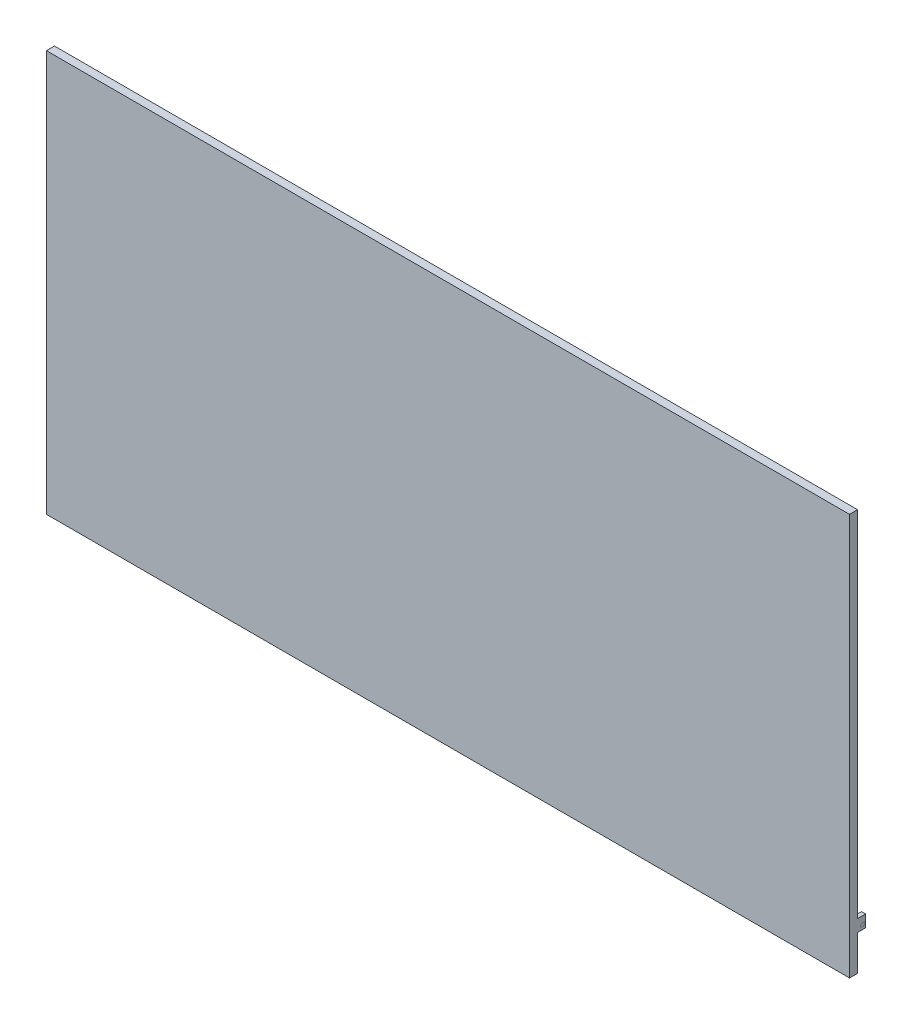
ISO-10303-21;
HEADER;
FILE_DESCRIPTION(('STEP AP214'),'2;1');
FILE_NAME('part.step','',(''),(''),'','','');
FILE_SCHEMA(('AUTOMOTIVE_DESIGN { 1 0 10303 214 1 1 1 1 }'));
ENDSEC;
DATA;
#1=APPLICATION_CONTEXT('core data for automotive mechanical design processes');
#2=APPLICATION_PROTOCOL_DEFINITION('international standard','automotive_design',2000,#1);
#3=PRODUCT_CONTEXT('',#1,'mechanical');
#4=PRODUCT('Part','Part','',(#3));
#5=PRODUCT_RELATED_PRODUCT_CATEGORY('part','',(#4));
#6=PRODUCT_DEFINITION_FORMATION('','',#4);
#7=PRODUCT_DEFINITION_CONTEXT('part definition',#1,'design');
#8=PRODUCT_DEFINITION('design','',#6,#7);
#9=PRODUCT_DEFINITION_SHAPE('','',#8);
#10=(LENGTH_UNIT() NAMED_UNIT(*) SI_UNIT(.MILLI.,.METRE.));
#11=(NAMED_UNIT(*) PLANE_ANGLE_UNIT() SI_UNIT($,.RADIAN.));
#12=(NAMED_UNIT(*) SI_UNIT($,.STERADIAN.) SOLID_ANGLE_UNIT());
#13=UNCERTAINTY_MEASURE_WITH_UNIT(LENGTH_MEASURE(1.E-05),#10,'distance_accuracy_value','');
#14=(GEOMETRIC_REPRESENTATION_CONTEXT(3) GLOBAL_UNCERTAINTY_ASSIGNED_CONTEXT((#13)) GLOBAL_UNIT_ASSIGNED_CONTEXT((#10,
#11,#12)) REPRESENTATION_CONTEXT('',''));
#15=CARTESIAN_POINT('',(0.,0.,0.));
#16=DIRECTION('',(0.,0.,1.));
#17=DIRECTION('',(1.,0.,0.));
#18=AXIS2_PLACEMENT_3D('',#15,#16,#17);
#19=CARTESIAN_POINT('',(443.244367229252,-116.841353694345,-10.));
#20=DIRECTION('',(1.,0.,0.));
#21=DIRECTION('',(0.,0.,-1.));
#22=AXIS2_PLACEMENT_3D('',#19,#20,#21);
#23=PLANE('',#22);
#24=DIRECTION('',(0.,1.,0.));
#25=VECTOR('',#24,1.);
#26=CARTESIAN_POINT('',(443.244367229252,-116.841353694345,0.));
#27=LINE('',#26,#25);
#28=CARTESIAN_POINT('',(443.244367229252,-241.841353694345,0.));
#29=VERTEX_POINT('',#28);
#30=CARTESIAN_POINT('',(443.244367229252,-116.841353694345,0.));
#31=VERTEX_POINT('',#30);
#32=EDGE_CURVE('E114',#29,#31,#27,.T.);
#33=ORIENTED_EDGE('',*,*,#32,.F.);
#34=DIRECTION('',(0.,0.,1.));
#35=VECTOR('',#34,1.);
#36=CARTESIAN_POINT('',(443.244367229252,-241.841353694345,-10.));
#37=LINE('',#36,#35);
#38=CARTESIAN_POINT('',(443.244367229252,-241.841353694345,-10.));
#39=VERTEX_POINT('',#38);
#40=EDGE_CURVE('E13',#39,#29,#37,.T.);
#41=ORIENTED_EDGE('',*,*,#40,.F.);
#42=DIRECTION('',(0.,1.,0.));
#43=VECTOR('',#42,1.);
#44=CARTESIAN_POINT('',(443.244367229252,-116.841353694345,-10.));
#45=LINE('',#44,#43);
#46=CARTESIAN_POINT('',(443.244367229252,-116.841353694345,-10.));
#47=VERTEX_POINT('',#46);
#48=EDGE_CURVE('E108',#39,#47,#45,.T.);
#49=ORIENTED_EDGE('',*,*,#48,.T.);
#50=DIRECTION('',(0.,0.,1.));
#51=VECTOR('',#50,1.);
#52=CARTESIAN_POINT('',(443.244367229252,-116.841353694345,-10.));
#53=LINE('',#52,#51);
#54=EDGE_CURVE('E53',#47,#31,#53,.T.);
#55=ORIENTED_EDGE('',*,*,#54,.T.);
#56=EDGE_LOOP('',(#33,#41,#49,#55));
#57=FACE_BOUND('',#56,.T.);
#58=ADVANCED_FACE('F50',(#57),#23,.T.);
#59=CARTESIAN_POINT('',(443.244367229252,-241.841353694345,-10.));
#60=DIRECTION('',(0.,-1.,0.));
#61=DIRECTION('',(1.,0.,0.));
#62=AXIS2_PLACEMENT_3D('',#59,#60,#61);
#63=PLANE('',#62);
#64=DIRECTION('',(1.,0.,0.));
#65=VECTOR('',#64,1.);
#66=CARTESIAN_POINT('',(443.244367229252,-241.841353694345,0.));
#67=LINE('',#66,#65);
#68=CARTESIAN_POINT('',(318.244367229252,-241.841353694345,0.));
#69=VERTEX_POINT('',#68);
#70=EDGE_CURVE('E110',#69,#29,#67,.T.);
#71=ORIENTED_EDGE('',*,*,#70,.F.);
#72=DIRECTION('',(0.,0.,1.));
#73=VECTOR('',#72,1.);
#74=CARTESIAN_POINT('',(318.244367229252,-241.841353694345,-10.));
#75=LINE('',#74,#73);
#76=CARTESIAN_POINT('',(318.244367229252,-241.841353694345,-10.));
#77=VERTEX_POINT('',#76);
#78=EDGE_CURVE('E59',#77,#69,#75,.T.);
#79=ORIENTED_EDGE('',*,*,#78,.F.);
#80=DIRECTION('',(1.,0.,0.));
#81=VECTOR('',#80,1.);
#82=CARTESIAN_POINT('',(443.244367229252,-241.841353694345,-10.));
#83=LINE('',#82,#81);
#84=EDGE_CURVE('E105',#77,#39,#83,.T.);
#85=ORIENTED_EDGE('',*,*,#84,.T.);
#86=ORIENTED_EDGE('',*,*,#40,.T.);
#87=EDGE_LOOP('',(#71,#79,#85,#86));
#88=FACE_BOUND('',#87,.T.);
#89=ADVANCED_FACE('F124',(#88),#63,.T.);
#90=CARTESIAN_POINT('',(318.244367229252,-116.841353694345,-10.));
#91=DIRECTION('',(-1.,0.,0.));
#92=DIRECTION('',(0.,0.,1.));
#93=AXIS2_PLACEMENT_3D('',#90,#91,#92);
#94=PLANE('',#93);
#95=DIRECTION('',(0.,-1.,0.));
#96=VECTOR('',#95,1.);
#97=CARTESIAN_POINT('',(318.244367229252,-116.841353694345,0.));
#98=LINE('',#97,#96);
#99=CARTESIAN_POINT('',(318.244367229252,-116.841353694345,0.));
#100=VERTEX_POINT('',#99);
#101=EDGE_CURVE('E100',#100,#69,#98,.T.);
#102=ORIENTED_EDGE('',*,*,#101,.F.);
#103=DIRECTION('',(0.,0.,1.));
#104=VECTOR('',#103,1.);
#105=CARTESIAN_POINT('',(318.244367229252,-116.841353694345,-10.));
#106=LINE('',#105,#104);
#107=CARTESIAN_POINT('',(318.244367229252,-116.841353694345,-10.));
#108=VERTEX_POINT('',#107);
#109=EDGE_CURVE('E95',#108,#100,#106,.T.);
#110=ORIENTED_EDGE('',*,*,#109,.F.);
#111=DIRECTION('',(0.,-1.,0.));
#112=VECTOR('',#111,1.);
#113=CARTESIAN_POINT('',(318.244367229252,-116.841353694345,-10.));
#114=LINE('',#113,#112);
#115=EDGE_CURVE('E98',#108,#77,#114,.T.);
#116=ORIENTED_EDGE('',*,*,#115,.T.);
#117=ORIENTED_EDGE('',*,*,#78,.T.);
#118=EDGE_LOOP('',(#102,#110,#116,#117));
#119=FACE_BOUND('',#118,.T.);
#120=ADVANCED_FACE('F97',(#119),#94,.T.);
#121=CARTESIAN_POINT('',(443.244367229252,-116.841353694345,-10.));
#122=DIRECTION('',(0.,1.,0.));
#123=DIRECTION('',(-1.,0.,0.));
#124=AXIS2_PLACEMENT_3D('',#121,#122,#123);
#125=PLANE('',#124);
#126=DIRECTION('',(-1.,0.,0.));
#127=VECTOR('',#126,1.);
#128=CARTESIAN_POINT('',(443.244367229252,-116.841353694345,0.));
#129=LINE('',#128,#127);
#130=EDGE_CURVE('E117',#31,#100,#129,.T.);
#131=ORIENTED_EDGE('',*,*,#130,.F.);
#132=ORIENTED_EDGE('',*,*,#54,.F.);
#133=DIRECTION('',(-1.,0.,0.));
#134=VECTOR('',#133,1.);
#135=CARTESIAN_POINT('',(443.244367229252,-116.841353694345,-10.));
#136=LINE('',#135,#134);
#137=EDGE_CURVE('E104',#47,#108,#136,.T.);
#138=ORIENTED_EDGE('',*,*,#137,.T.);
#139=ORIENTED_EDGE('',*,*,#109,.T.);
#140=EDGE_LOOP('',(#131,#132,#138,#139));
#141=FACE_BOUND('',#140,.T.);
#142=ADVANCED_FACE('F107',(#141),#125,.T.);
#143=CARTESIAN_POINT('',(0.,0.,-10.));
#144=DIRECTION('',(0.,0.,-1.));
#145=DIRECTION('',(-1.,0.,0.));
#146=AXIS2_PLACEMENT_3D('',#143,#144,#145);
#147=PLANE('',#146);
#148=ORIENTED_EDGE('',*,*,#48,.F.);
#149=ORIENTED_EDGE('',*,*,#84,.F.);
#150=ORIENTED_EDGE('',*,*,#115,.F.);
#151=ORIENTED_EDGE('',*,*,#137,.F.);
#152=EDGE_LOOP('',(#148,#149,#150,#151));
#153=FACE_BOUND('',#152,.T.);
#154=ADVANCED_FACE('F103',(#153),#147,.T.);
#155=CARTESIAN_POINT('',(0.,0.,0.));
#156=DIRECTION('',(0.,0.,-1.));
#157=DIRECTION('',(-1.,0.,0.));
#158=AXIS2_PLACEMENT_3D('',#155,#156,#157);
#159=PLANE('',#158);
#160=ORIENTED_EDGE('',*,*,#32,.T.);
#161=ORIENTED_EDGE('',*,*,#130,.T.);
#162=ORIENTED_EDGE('',*,*,#101,.T.);
#163=ORIENTED_EDGE('',*,*,#70,.T.);
#164=EDGE_LOOP('',(#160,#161,#162,#163));
#165=FACE_BOUND('',#164,.T.);
#166=ADVANCED_FACE('F123',(#165),#159,.F.);
#167=CLOSED_SHELL('',(#58,#89,#120,#142,#154,#166));
#168=MANIFOLD_SOLID_BREP('B2',#167);
#169=CARTESIAN_POINT('',(0.,0.,-0.01));
#170=DIRECTION('',(0.,0.,1.));
#171=DIRECTION('',(1.,0.,0.));
#172=AXIS2_PLACEMENT_3D('',#169,#170,#171);
#173=PLANE('',#172);
#174=DIRECTION('',(1.,0.,0.));
#175=VECTOR('',#174,1.);
#176=CARTESIAN_POINT('',(474.06976744186,-185.094305416104,-0.01));
#177=LINE('',#176,#175);
#178=CARTESIAN_POINT('',(474.06976744186,-185.094305416104,-0.01));
#179=VERTEX_POINT('',#178);
#180=CARTESIAN_POINT('',(479.06976744186,-185.094305416104,-0.01));
#181=VERTEX_POINT('',#180);
#182=EDGE_CURVE('E196',#179,#181,#177,.T.);
#183=ORIENTED_EDGE('',*,*,#182,.F.);
#184=DIRECTION('',(0.,1.,0.));
#185=VECTOR('',#184,1.);
#186=CARTESIAN_POINT('',(474.06976744186,-185.094305416104,-0.01));
#187=LINE('',#186,#185);
#188=CARTESIAN_POINT('',(474.06976744186,-200.094305416104,-0.01));
#189=VERTEX_POINT('',#188);
#190=EDGE_CURVE('E301',#189,#179,#187,.T.);
#191=ORIENTED_EDGE('',*,*,#190,.F.);
#192=DIRECTION('',(-1.,0.,0.));
#193=VECTOR('',#192,1.);
#194=CARTESIAN_POINT('',(474.06976744186,-200.094305416104,-0.01));
#195=LINE('',#194,#193);
#196=CARTESIAN_POINT('',(479.06976744186,-200.094305416104,-0.01));
#197=VERTEX_POINT('',#196);
#198=EDGE_CURVE('E298',#197,#189,#195,.T.);
#199=ORIENTED_EDGE('',*,*,#198,.F.);
#200=DIRECTION('',(0.,1.,0.));
#201=VECTOR('',#200,1.);
#202=CARTESIAN_POINT('',(479.06976744186,255.813953488372,-0.01));
#203=LINE('',#202,#201);
#204=CARTESIAN_POINT('',(479.06976744186,-244.186046511628,-0.01));
#205=VERTEX_POINT('',#204);
#206=EDGE_CURVE('E360',#205,#197,#203,.T.);
#207=ORIENTED_EDGE('',*,*,#206,.F.);
#208=DIRECTION('',(1.,0.,0.));
#209=VECTOR('',#208,1.);
#210=CARTESIAN_POINT('',(-520.93023255814,-244.186046511628,-0.01));
#211=LINE('',#210,#209);
#212=CARTESIAN_POINT('',(-520.93023255814,-244.186046511628,-0.01));
#213=VERTEX_POINT('',#212);
#214=EDGE_CURVE('E357',#213,#205,#211,.T.);
#215=ORIENTED_EDGE('',*,*,#214,.F.);
#216=DIRECTION('',(0.,-1.,0.));
#217=VECTOR('',#216,1.);
#218=CARTESIAN_POINT('',(-520.93023255814,255.813953488372,-0.01));
#219=LINE('',#218,#217);
#220=CARTESIAN_POINT('',(-520.93023255814,-207.514368944534,-0.01));
#221=VERTEX_POINT('',#220);
#222=EDGE_CURVE('E353',#221,#213,#219,.T.);
#223=ORIENTED_EDGE('',*,*,#222,.F.);
#224=DIRECTION('',(1.,0.,0.));
#225=VECTOR('',#224,1.);
#226=CARTESIAN_POINT('',(0.,-207.514368944534,-0.01));
#227=LINE('',#226,#225);
#228=CARTESIAN_POINT('',(-515.934557334186,-207.514368944534,-0.01));
#229=VERTEX_POINT('',#228);
#230=EDGE_CURVE('E369',#221,#229,#227,.T.);
#231=ORIENTED_EDGE('',*,*,#230,.T.);
#232=DIRECTION('',(0.,1.,0.));
#233=VECTOR('',#232,1.);
#234=CARTESIAN_POINT('',(-515.934557334186,0.,-0.01));
#235=LINE('',#234,#233);
#236=CARTESIAN_POINT('',(-515.934557334186,-192.514368944533,-0.00999999999999959));
#237=VERTEX_POINT('',#236);
#238=EDGE_CURVE('E377',#229,#237,#235,.T.);
#239=ORIENTED_EDGE('',*,*,#238,.T.);
#240=DIRECTION('',(-1.,0.,0.));
#241=VECTOR('',#240,1.);
#242=CARTESIAN_POINT('',(0.,-192.514368944533,-0.01));
#243=LINE('',#242,#241);
#244=CARTESIAN_POINT('',(-520.93023255814,-192.514368944533,-0.01));
#245=VERTEX_POINT('',#244);
#246=EDGE_CURVE('E189',#237,#245,#243,.T.);
#247=ORIENTED_EDGE('',*,*,#246,.T.);
#248=CARTESIAN_POINT('',(-520.93023255814,255.813953488372,-0.01));
#249=VERTEX_POINT('',#248);
#250=EDGE_CURVE('E354',#249,#245,#219,.T.);
#251=ORIENTED_EDGE('',*,*,#250,.F.);
#252=DIRECTION('',(-1.,0.,0.));
#253=VECTOR('',#252,1.);
#254=CARTESIAN_POINT('',(-520.93023255814,255.813953488372,-0.01));
#255=LINE('',#254,#253);
#256=CARTESIAN_POINT('',(479.06976744186,255.813953488372,-0.01));
#257=VERTEX_POINT('',#256);
#258=EDGE_CURVE('E363',#257,#249,#255,.T.);
#259=ORIENTED_EDGE('',*,*,#258,.F.);
#260=EDGE_CURVE('E201',#181,#257,#203,.T.);
#261=ORIENTED_EDGE('',*,*,#260,.F.);
#262=EDGE_LOOP('',(#183,#191,#199,#207,#215,#223,#231,#239,#247,#251,#259,#261));
#263=FACE_BOUND('',#262,.T.);
#264=ADVANCED_FACE('F181',(#263),#173,.F.);
#265=CARTESIAN_POINT('',(-520.93023255814,255.813953488372,-0.01));
#266=DIRECTION('',(-1.,0.,0.));
#267=DIRECTION('',(0.,0.,1.));
#268=AXIS2_PLACEMENT_3D('',#265,#266,#267);
#269=PLANE('',#268);
#270=DIRECTION('',(0.,0.,-1.));
#271=VECTOR('',#270,1.);
#272=CARTESIAN_POINT('',(-520.93023255814,-192.514368944533,-0.01));
#273=LINE('',#272,#271);
#274=CARTESIAN_POINT('',(-520.93023255814,-192.514368944533,0.));
#275=VERTEX_POINT('',#274);
#276=EDGE_CURVE('E339',#275,#245,#273,.T.);
#277=ORIENTED_EDGE('',*,*,#276,.F.);
#278=DIRECTION('',(0.,1.,0.));
#279=VECTOR('',#278,1.);
#280=CARTESIAN_POINT('',(-520.93023255814,255.813953488372,0.));
#281=LINE('',#280,#279);
#282=CARTESIAN_POINT('',(-520.93023255814,-207.514368944534,0.));
#283=VERTEX_POINT('',#282);
#284=EDGE_CURVE('E48',#283,#275,#281,.T.);
#285=ORIENTED_EDGE('',*,*,#284,.F.);
#286=DIRECTION('',(0.,0.,1.));
#287=VECTOR('',#286,1.);
#288=CARTESIAN_POINT('',(-520.93023255814,-207.514368944534,-0.01));
#289=LINE('',#288,#287);
#290=EDGE_CURVE('E331',#221,#283,#289,.T.);
#291=ORIENTED_EDGE('',*,*,#290,.F.);
#292=ORIENTED_EDGE('',*,*,#222,.T.);
#293=DIRECTION('',(0.,0.,1.));
#294=VECTOR('',#293,1.);
#295=CARTESIAN_POINT('',(-520.93023255814,-244.186046511628,-0.01));
#296=LINE('',#295,#294);
#297=CARTESIAN_POINT('',(-520.93023255814,-244.186046511628,10.));
#298=VERTEX_POINT('',#297);
#299=EDGE_CURVE('E366',#213,#298,#296,.T.);
#300=ORIENTED_EDGE('',*,*,#299,.T.);
#301=DIRECTION('',(0.,-1.,0.));
#302=VECTOR('',#301,1.);
#303=CARTESIAN_POINT('',(-520.93023255814,255.813953488372,10.));
#304=LINE('',#303,#302);
#305=CARTESIAN_POINT('',(-520.93023255814,255.813953488372,10.));
#306=VERTEX_POINT('',#305);
#307=EDGE_CURVE('E341',#306,#298,#304,.T.);
#308=ORIENTED_EDGE('',*,*,#307,.F.);
#309=DIRECTION('',(0.,0.,1.));
#310=VECTOR('',#309,1.);
#311=CARTESIAN_POINT('',(-520.93023255814,255.813953488372,-0.01));
#312=LINE('',#311,#310);
#313=EDGE_CURVE('E367',#249,#306,#312,.T.);
#314=ORIENTED_EDGE('',*,*,#313,.F.);
#315=ORIENTED_EDGE('',*,*,#250,.T.);
#316=EDGE_LOOP('',(#277,#285,#291,#292,#300,#308,#314,#315));
#317=FACE_BOUND('',#316,.T.);
#318=ADVANCED_FACE('F183',(#317),#269,.T.);
#319=CARTESIAN_POINT('',(-520.93023255814,255.813953488372,-0.01));
#320=DIRECTION('',(0.,1.,0.));
#321=DIRECTION('',(0.,0.,1.));
#322=AXIS2_PLACEMENT_3D('',#319,#320,#321);
#323=PLANE('',#322);
#324=ORIENTED_EDGE('',*,*,#313,.T.);
#325=DIRECTION('',(-1.,0.,0.));
#326=VECTOR('',#325,1.);
#327=CARTESIAN_POINT('',(-520.93023255814,255.813953488372,10.));
#328=LINE('',#327,#326);
#329=CARTESIAN_POINT('',(479.06976744186,255.813953488372,10.));
#330=VERTEX_POINT('',#329);
#331=EDGE_CURVE('E350',#330,#306,#328,.T.);
#332=ORIENTED_EDGE('',*,*,#331,.F.);
#333=DIRECTION('',(0.,0.,1.));
#334=VECTOR('',#333,1.);
#335=CARTESIAN_POINT('',(479.06976744186,255.813953488372,-0.01));
#336=LINE('',#335,#334);
#337=EDGE_CURVE('E370',#257,#330,#336,.T.);
#338=ORIENTED_EDGE('',*,*,#337,.F.);
#339=ORIENTED_EDGE('',*,*,#258,.T.);
#340=EDGE_LOOP('',(#324,#332,#338,#339));
#341=FACE_BOUND('',#340,.T.);
#342=ADVANCED_FACE('F389',(#341),#323,.T.);
#343=CARTESIAN_POINT('',(479.06976744186,255.813953488372,-0.01));
#344=DIRECTION('',(1.,0.,0.));
#345=DIRECTION('',(0.,0.,-1.));
#346=AXIS2_PLACEMENT_3D('',#343,#344,#345);
#347=PLANE('',#346);
#348=ORIENTED_EDGE('',*,*,#337,.T.);
#349=DIRECTION('',(0.,1.,0.));
#350=VECTOR('',#349,1.);
#351=CARTESIAN_POINT('',(479.06976744186,255.813953488372,10.));
#352=LINE('',#351,#350);
#353=CARTESIAN_POINT('',(479.06976744186,-244.186046511628,10.));
#354=VERTEX_POINT('',#353);
#355=EDGE_CURVE('E347',#354,#330,#352,.T.);
#356=ORIENTED_EDGE('',*,*,#355,.F.);
#357=DIRECTION('',(0.,0.,1.));
#358=VECTOR('',#357,1.);
#359=CARTESIAN_POINT('',(479.06976744186,-244.186046511628,-0.01));
#360=LINE('',#359,#358);
#361=EDGE_CURVE('E372',#205,#354,#360,.T.);
#362=ORIENTED_EDGE('',*,*,#361,.F.);
#363=ORIENTED_EDGE('',*,*,#206,.T.);
#364=DIRECTION('',(0.,0.,1.));
#365=VECTOR('',#364,1.);
#366=CARTESIAN_POINT('',(479.06976744186,-200.094305416104,-10.01));
#367=LINE('',#366,#365);
#368=CARTESIAN_POINT('',(479.06976744186,-200.094305416104,-10.01));
#369=VERTEX_POINT('',#368);
#370=EDGE_CURVE('E307',#369,#197,#367,.T.);
#371=ORIENTED_EDGE('',*,*,#370,.F.);
#372=DIRECTION('',(0.,-1.,0.));
#373=VECTOR('',#372,1.);
#374=CARTESIAN_POINT('',(479.06976744186,-185.094305416104,-10.01));
#375=LINE('',#374,#373);
#376=CARTESIAN_POINT('',(479.06976744186,-185.094305416104,-10.01));
#377=VERTEX_POINT('',#376);
#378=EDGE_CURVE('E288',#377,#369,#375,.T.);
#379=ORIENTED_EDGE('',*,*,#378,.F.);
#380=DIRECTION('',(0.,0.,1.));
#381=VECTOR('',#380,1.);
#382=CARTESIAN_POINT('',(479.06976744186,-185.094305416104,-10.01));
#383=LINE('',#382,#381);
#384=EDGE_CURVE('E285',#377,#181,#383,.T.);
#385=ORIENTED_EDGE('',*,*,#384,.T.);
#386=ORIENTED_EDGE('',*,*,#260,.T.);
#387=EDGE_LOOP('',(#348,#356,#362,#363,#371,#379,#385,#386));
#388=FACE_BOUND('',#387,.T.);
#389=ADVANCED_FACE('F396',(#388),#347,.T.);
#390=CARTESIAN_POINT('',(-520.93023255814,-244.186046511628,-0.01));
#391=DIRECTION('',(0.,-1.,0.));
#392=DIRECTION('',(0.,0.,-1.));
#393=AXIS2_PLACEMENT_3D('',#390,#391,#392);
#394=PLANE('',#393);
#395=ORIENTED_EDGE('',*,*,#361,.T.);
#396=DIRECTION('',(1.,0.,0.));
#397=VECTOR('',#396,1.);
#398=CARTESIAN_POINT('',(-520.93023255814,-244.186046511628,10.));
#399=LINE('',#398,#397);
#400=EDGE_CURVE('E344',#298,#354,#399,.T.);
#401=ORIENTED_EDGE('',*,*,#400,.F.);
#402=ORIENTED_EDGE('',*,*,#299,.F.);
#403=ORIENTED_EDGE('',*,*,#214,.T.);
#404=EDGE_LOOP('',(#395,#401,#402,#403));
#405=FACE_BOUND('',#404,.T.);
#406=ADVANCED_FACE('F414',(#405),#394,.T.);
#407=CARTESIAN_POINT('',(0.,0.,10.));
#408=DIRECTION('',(0.,0.,1.));
#409=DIRECTION('',(1.,0.,0.));
#410=AXIS2_PLACEMENT_3D('',#407,#408,#409);
#411=PLANE('',#410);
#412=ORIENTED_EDGE('',*,*,#307,.T.);
#413=ORIENTED_EDGE('',*,*,#400,.T.);
#414=ORIENTED_EDGE('',*,*,#355,.T.);
#415=ORIENTED_EDGE('',*,*,#331,.T.);
#416=EDGE_LOOP('',(#412,#413,#414,#415));
#417=FACE_BOUND('',#416,.T.);
#418=ADVANCED_FACE('F392',(#417),#411,.T.);
#419=CARTESIAN_POINT('',(-515.934557334186,-192.514368944533,-10.));
#420=DIRECTION('',(1.,0.,0.));
#421=DIRECTION('',(0.,0.,-1.));
#422=AXIS2_PLACEMENT_3D('',#419,#420,#421);
#423=PLANE('',#422);
#424=ORIENTED_EDGE('',*,*,#238,.F.);
#425=DIRECTION('',(0.,0.,1.));
#426=VECTOR('',#425,1.);
#427=CARTESIAN_POINT('',(-515.934557334186,-207.514368944534,-10.));
#428=LINE('',#427,#426);
#429=CARTESIAN_POINT('',(-515.934557334186,-207.514368944534,-10.));
#430=VERTEX_POINT('',#429);
#431=EDGE_CURVE('E335',#430,#229,#428,.T.);
#432=ORIENTED_EDGE('',*,*,#431,.F.);
#433=DIRECTION('',(0.,1.,0.));
#434=VECTOR('',#433,1.);
#435=CARTESIAN_POINT('',(-515.934557334186,-192.514368944533,-10.));
#436=LINE('',#435,#434);
#437=CARTESIAN_POINT('',(-515.934557334186,-192.514368944533,-10.));
#438=VERTEX_POINT('',#437);
#439=EDGE_CURVE('E318',#430,#438,#436,.T.);
#440=ORIENTED_EDGE('',*,*,#439,.T.);
#441=DIRECTION('',(0.,0.,1.));
#442=VECTOR('',#441,1.);
#443=CARTESIAN_POINT('',(-515.934557334186,-192.514368944533,-10.));
#444=LINE('',#443,#442);
#445=EDGE_CURVE('E332',#438,#237,#444,.T.);
#446=ORIENTED_EDGE('',*,*,#445,.T.);
#447=EDGE_LOOP('',(#424,#432,#440,#446));
#448=FACE_BOUND('',#447,.T.);
#449=ADVANCED_FACE('F422',(#448),#423,.T.);
#450=CARTESIAN_POINT('',(-520.934557334186,-192.514368944533,-10.));
#451=DIRECTION('',(-1.,0.,0.));
#452=DIRECTION('',(0.,0.,1.));
#453=AXIS2_PLACEMENT_3D('',#450,#451,#452);
#454=PLANE('',#453);
#455=DIRECTION('',(0.,-1.,0.));
#456=VECTOR('',#455,1.);
#457=CARTESIAN_POINT('',(-520.934557334186,-192.514368944533,0.));
#458=LINE('',#457,#456);
#459=CARTESIAN_POINT('',(-520.934557334186,-192.514368944533,0.));
#460=VERTEX_POINT('',#459);
#461=CARTESIAN_POINT('',(-520.934557334186,-207.514368944534,0.));
#462=VERTEX_POINT('',#461);
#463=EDGE_CURVE('E302',#460,#462,#458,.T.);
#464=ORIENTED_EDGE('',*,*,#463,.F.);
#465=DIRECTION('',(0.,0.,1.));
#466=VECTOR('',#465,1.);
#467=CARTESIAN_POINT('',(-520.934557334186,-192.514368944533,-10.));
#468=LINE('',#467,#466);
#469=CARTESIAN_POINT('',(-520.934557334186,-192.514368944533,-10.));
#470=VERTEX_POINT('',#469);
#471=EDGE_CURVE('E328',#470,#460,#468,.T.);
#472=ORIENTED_EDGE('',*,*,#471,.F.);
#473=DIRECTION('',(0.,-1.,0.));
#474=VECTOR('',#473,1.);
#475=CARTESIAN_POINT('',(-520.934557334186,-192.514368944533,-10.));
#476=LINE('',#475,#474);
#477=CARTESIAN_POINT('',(-520.934557334186,-207.514368944534,-10.));
#478=VERTEX_POINT('',#477);
#479=EDGE_CURVE('E311',#470,#478,#476,.T.);
#480=ORIENTED_EDGE('',*,*,#479,.T.);
#481=DIRECTION('',(0.,0.,1.));
#482=VECTOR('',#481,1.);
#483=CARTESIAN_POINT('',(-520.934557334186,-207.514368944534,-10.));
#484=LINE('',#483,#482);
#485=EDGE_CURVE('E323',#478,#462,#484,.T.);
#486=ORIENTED_EDGE('',*,*,#485,.T.);
#487=EDGE_LOOP('',(#464,#472,#480,#486));
#488=FACE_BOUND('',#487,.T.);
#489=ADVANCED_FACE('F431',(#488),#454,.T.);
#490=CARTESIAN_POINT('',(-520.934557334186,-192.514368944533,-10.));
#491=DIRECTION('',(0.,1.,0.));
#492=DIRECTION('',(0.,0.,1.));
#493=AXIS2_PLACEMENT_3D('',#490,#491,#492);
#494=PLANE('',#493);
#495=DIRECTION('',(-1.,0.,0.));
#496=VECTOR('',#495,1.);
#497=CARTESIAN_POINT('',(-520.934557334186,-192.514368944533,0.));
#498=LINE('',#497,#496);
#499=EDGE_CURVE('E315',#275,#460,#498,.T.);
#500=ORIENTED_EDGE('',*,*,#499,.F.);
#501=ORIENTED_EDGE('',*,*,#276,.T.);
#502=ORIENTED_EDGE('',*,*,#246,.F.);
#503=ORIENTED_EDGE('',*,*,#445,.F.);
#504=DIRECTION('',(-1.,0.,0.));
#505=VECTOR('',#504,1.);
#506=CARTESIAN_POINT('',(-520.934557334186,-192.514368944533,-10.));
#507=LINE('',#506,#505);
#508=EDGE_CURVE('E321',#438,#470,#507,.T.);
#509=ORIENTED_EDGE('',*,*,#508,.T.);
#510=ORIENTED_EDGE('',*,*,#471,.T.);
#511=EDGE_LOOP('',(#500,#501,#502,#503,#509,#510));
#512=FACE_BOUND('',#511,.T.);
#513=ADVANCED_FACE('F425',(#512),#494,.T.);
#514=CARTESIAN_POINT('',(-520.934557334186,-207.514368944534,-10.));
#515=DIRECTION('',(0.,-1.,0.));
#516=DIRECTION('',(0.,0.,-1.));
#517=AXIS2_PLACEMENT_3D('',#514,#515,#516);
#518=PLANE('',#517);
#519=ORIENTED_EDGE('',*,*,#230,.F.);
#520=ORIENTED_EDGE('',*,*,#290,.T.);
#521=DIRECTION('',(1.,0.,0.));
#522=VECTOR('',#521,1.);
#523=CARTESIAN_POINT('',(-520.934557334186,-207.514368944534,0.));
#524=LINE('',#523,#522);
#525=EDGE_CURVE('E305',#462,#283,#524,.T.);
#526=ORIENTED_EDGE('',*,*,#525,.F.);
#527=ORIENTED_EDGE('',*,*,#485,.F.);
#528=DIRECTION('',(1.,0.,0.));
#529=VECTOR('',#528,1.);
#530=CARTESIAN_POINT('',(-520.934557334186,-207.514368944534,-10.));
#531=LINE('',#530,#529);
#532=EDGE_CURVE('E314',#478,#430,#531,.T.);
#533=ORIENTED_EDGE('',*,*,#532,.T.);
#534=ORIENTED_EDGE('',*,*,#431,.T.);
#535=EDGE_LOOP('',(#519,#520,#526,#527,#533,#534));
#536=FACE_BOUND('',#535,.T.);
#537=ADVANCED_FACE('F417',(#536),#518,.T.);
#538=CARTESIAN_POINT('',(0.,0.,-10.));
#539=DIRECTION('',(0.,0.,1.));
#540=DIRECTION('',(1.,0.,0.));
#541=AXIS2_PLACEMENT_3D('',#538,#539,#540);
#542=PLANE('',#541);
#543=ORIENTED_EDGE('',*,*,#479,.F.);
#544=ORIENTED_EDGE('',*,*,#508,.F.);
#545=ORIENTED_EDGE('',*,*,#439,.F.);
#546=ORIENTED_EDGE('',*,*,#532,.F.);
#547=EDGE_LOOP('',(#543,#544,#545,#546));
#548=FACE_BOUND('',#547,.T.);
#549=ADVANCED_FACE('F429',(#548),#542,.F.);
#550=CARTESIAN_POINT('',(0.,0.,0.));
#551=DIRECTION('',(0.,0.,1.));
#552=DIRECTION('',(1.,0.,0.));
#553=AXIS2_PLACEMENT_3D('',#550,#551,#552);
#554=PLANE('',#553);
#555=ORIENTED_EDGE('',*,*,#525,.T.);
#556=ORIENTED_EDGE('',*,*,#284,.T.);
#557=ORIENTED_EDGE('',*,*,#499,.T.);
#558=ORIENTED_EDGE('',*,*,#463,.T.);
#559=EDGE_LOOP('',(#555,#556,#557,#558));
#560=FACE_BOUND('',#559,.T.);
#561=ADVANCED_FACE('F433',(#560),#554,.T.);
#562=CARTESIAN_POINT('',(474.06976744186,-185.094305416104,-10.01));
#563=DIRECTION('',(1.,0.,0.));
#564=DIRECTION('',(0.,0.,-1.));
#565=AXIS2_PLACEMENT_3D('',#562,#563,#564);
#566=PLANE('',#565);
#567=ORIENTED_EDGE('',*,*,#190,.T.);
#568=DIRECTION('',(0.,0.,1.));
#569=VECTOR('',#568,1.);
#570=CARTESIAN_POINT('',(474.06976744186,-185.094305416104,-10.01));
#571=LINE('',#570,#569);
#572=CARTESIAN_POINT('',(474.06976744186,-185.094305416104,-10.01));
#573=VERTEX_POINT('',#572);
#574=EDGE_CURVE('E282',#573,#179,#571,.T.);
#575=ORIENTED_EDGE('',*,*,#574,.F.);
#576=DIRECTION('',(0.,1.,0.));
#577=VECTOR('',#576,1.);
#578=CARTESIAN_POINT('',(474.06976744186,-185.094305416104,-10.01));
#579=LINE('',#578,#577);
#580=CARTESIAN_POINT('',(474.06976744186,-200.094305416104,-10.01));
#581=VERTEX_POINT('',#580);
#582=EDGE_CURVE('E289',#581,#573,#579,.T.);
#583=ORIENTED_EDGE('',*,*,#582,.F.);
#584=DIRECTION('',(0.,0.,1.));
#585=VECTOR('',#584,1.);
#586=CARTESIAN_POINT('',(474.06976744186,-200.094305416104,-10.01));
#587=LINE('',#586,#585);
#588=EDGE_CURVE('E401',#581,#189,#587,.T.);
#589=ORIENTED_EDGE('',*,*,#588,.T.);
#590=EDGE_LOOP('',(#567,#575,#583,#589));
#591=FACE_BOUND('',#590,.T.);
#592=ADVANCED_FACE('F300',(#591),#566,.F.);
#593=CARTESIAN_POINT('',(474.06976744186,-185.094305416104,-10.01));
#594=DIRECTION('',(0.,-1.,0.));
#595=DIRECTION('',(0.,0.,-1.));
#596=AXIS2_PLACEMENT_3D('',#593,#594,#595);
#597=PLANE('',#596);
#598=ORIENTED_EDGE('',*,*,#182,.T.);
#599=ORIENTED_EDGE('',*,*,#384,.F.);
#600=DIRECTION('',(1.,0.,0.));
#601=VECTOR('',#600,1.);
#602=CARTESIAN_POINT('',(474.06976744186,-185.094305416104,-10.01));
#603=LINE('',#602,#601);
#604=EDGE_CURVE('E278',#573,#377,#603,.T.);
#605=ORIENTED_EDGE('',*,*,#604,.F.);
#606=ORIENTED_EDGE('',*,*,#574,.T.);
#607=EDGE_LOOP('',(#598,#599,#605,#606));
#608=FACE_BOUND('',#607,.T.);
#609=ADVANCED_FACE('F280',(#608),#597,.F.);
#610=CARTESIAN_POINT('',(474.06976744186,-200.094305416104,-10.01));
#611=DIRECTION('',(0.,1.,0.));
#612=DIRECTION('',(0.,0.,1.));
#613=AXIS2_PLACEMENT_3D('',#610,#611,#612);
#614=PLANE('',#613);
#615=ORIENTED_EDGE('',*,*,#198,.T.);
#616=ORIENTED_EDGE('',*,*,#588,.F.);
#617=DIRECTION('',(-1.,0.,0.));
#618=VECTOR('',#617,1.);
#619=CARTESIAN_POINT('',(474.06976744186,-200.094305416104,-10.01));
#620=LINE('',#619,#618);
#621=EDGE_CURVE('E294',#369,#581,#620,.T.);
#622=ORIENTED_EDGE('',*,*,#621,.F.);
#623=ORIENTED_EDGE('',*,*,#370,.T.);
#624=EDGE_LOOP('',(#615,#616,#622,#623));
#625=FACE_BOUND('',#624,.T.);
#626=ADVANCED_FACE('F409',(#625),#614,.F.);
#627=CARTESIAN_POINT('',(0.,0.,-10.01));
#628=DIRECTION('',(0.,0.,1.));
#629=DIRECTION('',(1.,0.,0.));
#630=AXIS2_PLACEMENT_3D('',#627,#628,#629);
#631=PLANE('',#630);
#632=ORIENTED_EDGE('',*,*,#582,.T.);
#633=ORIENTED_EDGE('',*,*,#604,.T.);
#634=ORIENTED_EDGE('',*,*,#378,.T.);
#635=ORIENTED_EDGE('',*,*,#621,.T.);
#636=EDGE_LOOP('',(#632,#633,#634,#635));
#637=FACE_BOUND('',#636,.T.);
#638=ADVANCED_FACE('F292',(#637),#631,.F.);
#639=CLOSED_SHELL('',(#264,#318,#342,#389,#406,#418,#449,#489,#513,#537,#549,#561,#592,#609,
#626,#638));
#640=MANIFOLD_SOLID_BREP('B7',#639);
#641=CARTESIAN_POINT('',(-520.941624263234,-200.459376812814,-5.9082754510174));
#642=DIRECTION('',(0.999975145545196,0.0070504107585743,0.));
#643=DIRECTION('',(0.,0.,-1.));
#644=AXIS2_PLACEMENT_3D('',#641,#642,#643);
#645=CYLINDRICAL_SURFACE('',#644,3.5);
#646=CARTESIAN_POINT('',(-520.953480415989,-200.459460405639,-5.9082754510174));
#647=DIRECTION('',(1.,0.,0.));
#648=DIRECTION('',(0.,1.,0.));
#649=AXIS2_PLACEMENT_3D('',#646,#647,#648);
#650=ELLIPSE('',#649,3.50008699275398,3.5);
#651=CARTESIAN_POINT('',(-520.953480415989,-196.959373412885,-5.9082754510174));
#652=VERTEX_POINT('',#651);
#653=EDGE_CURVE('E180',#652,#652,#650,.T.);
#654=ORIENTED_EDGE('',*,*,#653,.T.);
#655=EDGE_LOOP('',(#654));
#656=FACE_BOUND('',#655,.T.);
#657=CARTESIAN_POINT('',(479.06976744186,-193.408710497573,-5.9082754510174));
#658=DIRECTION('',(1.,0.,0.));
#659=DIRECTION('',(0.,1.,0.));
#660=AXIS2_PLACEMENT_3D('',#657,#658,#659);
#661=ELLIPSE('',#660,3.50008699275398,3.5);
#662=CARTESIAN_POINT('',(479.06976744186,-189.908623504819,-5.9082754510174));
#663=VERTEX_POINT('',#662);
#664=EDGE_CURVE('E569',#663,#663,#661,.T.);
#665=ORIENTED_EDGE('',*,*,#664,.F.);
#666=EDGE_LOOP('',(#665));
#667=FACE_BOUND('',#666,.T.);
#668=ADVANCED_FACE('F566',(#656,#667),#645,.T.);
#669=CARTESIAN_POINT('',(-520.953480415989,-197.096166974027,-4.));
#670=DIRECTION('',(1.,0.,0.));
#671=DIRECTION('',(0.,0.,-1.));
#672=AXIS2_PLACEMENT_3D('',#669,#670,#671);
#673=PLANE('',#672);
#674=ORIENTED_EDGE('',*,*,#653,.F.);
#675=EDGE_LOOP('',(#674));
#676=FACE_BOUND('',#675,.T.);
#677=ADVANCED_FACE('F581',(#676),#673,.F.);
#678=CARTESIAN_POINT('',(479.06976744186,-197.096166974027,-4.));
#679=DIRECTION('',(1.,0.,0.));
#680=DIRECTION('',(0.,0.,-1.));
#681=AXIS2_PLACEMENT_3D('',#678,#679,#680);
#682=PLANE('',#681);
#683=ORIENTED_EDGE('',*,*,#664,.T.);
#684=EDGE_LOOP('',(#683));
#685=FACE_BOUND('',#684,.T.);
#686=ADVANCED_FACE('F578',(#685),#682,.T.);
#687=CLOSED_SHELL('',(#668,#677,#686));
#688=MANIFOLD_SOLID_BREP('B42',#687);
#689=ADVANCED_BREP_SHAPE_REPRESENTATION('',(#18,#168,#640,#688),#14);
#690=SHAPE_DEFINITION_REPRESENTATION(#9,#689);
ENDSEC;
END-ISO-10303-21;
